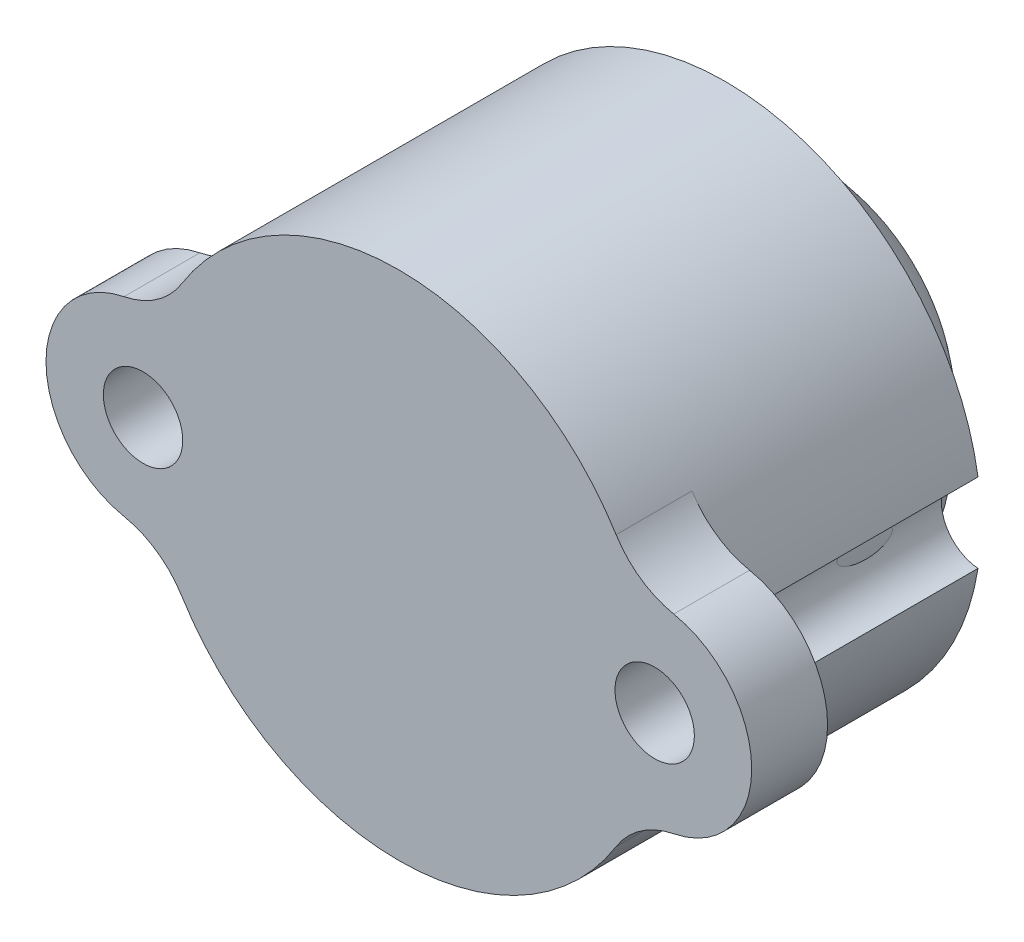
ISO-10303-21;
HEADER;
FILE_DESCRIPTION(('STEP AP214'),'2;1');
FILE_NAME('part.step','',(''),(''),'','','');
FILE_SCHEMA(('AUTOMOTIVE_DESIGN { 1 0 10303 214 1 1 1 1 }'));
ENDSEC;
DATA;
#1=APPLICATION_CONTEXT('core data for automotive mechanical design processes');
#2=APPLICATION_PROTOCOL_DEFINITION('international standard','automotive_design',2000,#1);
#3=PRODUCT_CONTEXT('',#1,'mechanical');
#4=PRODUCT('Part','Part','',(#3));
#5=PRODUCT_RELATED_PRODUCT_CATEGORY('part','',(#4));
#6=PRODUCT_DEFINITION_FORMATION('','',#4);
#7=PRODUCT_DEFINITION_CONTEXT('part definition',#1,'design');
#8=PRODUCT_DEFINITION('design','',#6,#7);
#9=PRODUCT_DEFINITION_SHAPE('','',#8);
#10=(LENGTH_UNIT() NAMED_UNIT(*) SI_UNIT(.MILLI.,.METRE.));
#11=(NAMED_UNIT(*) PLANE_ANGLE_UNIT() SI_UNIT($,.RADIAN.));
#12=(NAMED_UNIT(*) SI_UNIT($,.STERADIAN.) SOLID_ANGLE_UNIT());
#13=UNCERTAINTY_MEASURE_WITH_UNIT(LENGTH_MEASURE(1.E-05),#10,'distance_accuracy_value','');
#14=(GEOMETRIC_REPRESENTATION_CONTEXT(3) GLOBAL_UNCERTAINTY_ASSIGNED_CONTEXT((#13)) GLOBAL_UNIT_ASSIGNED_CONTEXT((#10,
#11,#12)) REPRESENTATION_CONTEXT('',''));
#15=CARTESIAN_POINT('',(0.,0.,0.));
#16=DIRECTION('',(0.,0.,1.));
#17=DIRECTION('',(1.,0.,0.));
#18=AXIS2_PLACEMENT_3D('',#15,#16,#17);
#19=CARTESIAN_POINT('',(-7.366,0.,0.));
#20=DIRECTION('',(0.,0.,1.));
#21=DIRECTION('',(1.,0.,0.));
#22=AXIS2_PLACEMENT_3D('',#19,#20,#21);
#23=CYLINDRICAL_SURFACE('',#22,1.143);
#24=CARTESIAN_POINT('',(-7.366,0.,9.398));
#25=DIRECTION('',(0.,0.,1.));
#26=DIRECTION('',(1.,0.,0.));
#27=AXIS2_PLACEMENT_3D('',#24,#25,#26);
#28=CIRCLE('',#27,1.143);
#29=CARTESIAN_POINT('',(-6.223,0.,9.398));
#30=VERTEX_POINT('',#29);
#31=EDGE_CURVE('E244',#30,#30,#28,.T.);
#32=ORIENTED_EDGE('',*,*,#31,.T.);
#33=EDGE_LOOP('',(#32));
#34=FACE_BOUND('',#33,.T.);
#35=CARTESIAN_POINT('',(-7.366,0.,0.));
#36=DIRECTION('',(0.,0.,1.));
#37=DIRECTION('',(1.,0.,0.));
#38=AXIS2_PLACEMENT_3D('',#35,#36,#37);
#39=CIRCLE('',#38,1.143);
#40=CARTESIAN_POINT('',(-7.27731896551724,-1.13955459462154,0.));
#41=VERTEX_POINT('',#40);
#42=CARTESIAN_POINT('',(-7.27731896551724,1.13955459462154,0.));
#43=VERTEX_POINT('',#42);
#44=EDGE_CURVE('E152',#41,#43,#39,.T.);
#45=ORIENTED_EDGE('',*,*,#44,.F.);
#46=DIRECTION('',(0.,0.,1.));
#47=VECTOR('',#46,1.);
#48=CARTESIAN_POINT('',(-7.27731896551724,-1.13955459462154,4.699));
#49=LINE('',#48,#47);
#50=CARTESIAN_POINT('',(-7.27731896551724,-1.13955459462154,7.2136));
#51=VERTEX_POINT('',#50);
#52=EDGE_CURVE('E66',#51,#41,#49,.F.);
#53=ORIENTED_EDGE('',*,*,#52,.F.);
#54=CARTESIAN_POINT('',(-7.366,0.,7.2136));
#55=DIRECTION('',(0.,0.,1.));
#56=DIRECTION('',(1.,0.,0.));
#57=AXIS2_PLACEMENT_3D('',#54,#55,#56);
#58=CIRCLE('',#57,1.143);
#59=CARTESIAN_POINT('',(-7.27731896551724,1.13955459462154,7.2136));
#60=VERTEX_POINT('',#59);
#61=EDGE_CURVE('E203',#60,#51,#58,.T.);
#62=ORIENTED_EDGE('',*,*,#61,.F.);
#63=DIRECTION('',(0.,0.,1.));
#64=VECTOR('',#63,1.);
#65=CARTESIAN_POINT('',(-7.27731896551724,1.13955459462154,4.699));
#66=LINE('',#65,#64);
#67=EDGE_CURVE('E249',#43,#60,#66,.T.);
#68=ORIENTED_EDGE('',*,*,#67,.F.);
#69=EDGE_LOOP('',(#45,#53,#62,#68));
#70=FACE_BOUND('',#69,.T.);
#71=CARTESIAN_POINT('',(-6.22299999667671,0.,3.00656686656911));
#72=CARTESIAN_POINT('',(-6.22300022308401,0.00854113840439753,3.00656496304866));
#73=CARTESIAN_POINT('',(-6.22309739064247,0.0170942445293236,3.00566804337497));
#74=CARTESIAN_POINT('',(-6.2234704915884,0.0338570945007122,3.00220702470581));
#75=CARTESIAN_POINT('',(-6.22374690498539,0.042065853177293,2.99963844904978));
#76=CARTESIAN_POINT('',(-6.22443571740399,0.057805020180403,2.99318784772456));
#77=CARTESIAN_POINT('',(-6.22484632200796,0.0653427943006503,2.98932313713181));
#78=CARTESIAN_POINT('',(-6.22576546470107,0.0797910081447651,2.98058911446436));
#79=CARTESIAN_POINT('',(-6.2262740150528,0.0867013691584653,2.97571967659479));
#80=CARTESIAN_POINT('',(-6.22781511439508,0.105523954284168,2.96079494743554));
#81=CARTESIAN_POINT('',(-6.22892652085305,0.116712603729425,2.94984180383498));
#82=CARTESIAN_POINT('',(-6.23124048047224,0.137395288844588,2.92644390518644));
#83=CARTESIAN_POINT('',(-6.23244336890737,0.146882616444506,2.91399355559374));
#84=CARTESIAN_POINT('',(-6.23616494735638,0.173978554588517,2.87432886175782));
#85=CARTESIAN_POINT('',(-6.23870934575976,0.189366409197521,2.84561878470594));
#86=CARTESIAN_POINT('',(-6.24357755252192,0.216326726606896,2.78649623212186));
#87=CARTESIAN_POINT('',(-6.2459007591384,0.22788898203461,2.75607945141608));
#88=CARTESIAN_POINT('',(-6.25058241423961,0.249880669760019,2.68916120019687));
#89=CARTESIAN_POINT('',(-6.25288239573668,0.259801426060839,2.65248946853826));
#90=CARTESIAN_POINT('',(-6.25696202421947,0.276687688887137,2.57842907915816));
#91=CARTESIAN_POINT('',(-6.25874104424745,0.283649639107923,2.54103961483653));
#92=CARTESIAN_POINT('',(-6.2632404180465,0.300866073946233,2.42814368806691));
#93=CARTESIAN_POINT('',(-6.26511415528667,0.307414863297735,2.35203495546075));
#94=CARTESIAN_POINT('',(-6.26658127371827,0.312630680617006,2.18817664305934));
#95=CARTESIAN_POINT('',(-6.26579367406989,0.309979291060852,2.10038074754725));
#96=CARTESIAN_POINT('',(-6.26230945073564,0.297201269522078,1.96972721365611));
#97=CARTESIAN_POINT('',(-6.26076631073974,0.291482886038891,1.92638239162202));
#98=CARTESIAN_POINT('',(-6.25695129958749,0.276627569313388,1.84033009117514));
#99=CARTESIAN_POINT('',(-6.25468026514882,0.26749455920119,1.79762193961152));
#100=CARTESIAN_POINT('',(-6.24977559412481,0.246164004699842,1.71808269188302));
#101=CARTESIAN_POINT('',(-6.24721033372765,0.234420008642109,1.6811260574621));
#102=CARTESIAN_POINT('',(-6.24167101149704,0.206277933713889,1.60891923022393));
#103=CARTESIAN_POINT('',(-6.23869737472813,0.18988467544145,1.57366731394963));
#104=CARTESIAN_POINT('',(-6.23417669898086,0.15976540784391,1.52389355260057));
#105=CARTESIAN_POINT('',(-6.23265297469159,0.148743598905754,1.50775600559318));
#106=CARTESIAN_POINT('',(-6.22970486395261,0.124240716565058,1.47748612892237));
#107=CARTESIAN_POINT('',(-6.22827986465712,0.110777135474807,1.46334073249681));
#108=CARTESIAN_POINT('',(-6.22647540782835,0.0892954815708801,1.44581907579016));
#109=CARTESIAN_POINT('',(-6.22596332372072,0.0825537685538465,1.44090348543767));
#110=CARTESIAN_POINT('',(-6.22502989662223,0.0684564006670779,1.43201312233724));
#111=CARTESIAN_POINT('',(-6.2246085634813,0.0611006792741993,1.42803845171021));
#112=CARTESIAN_POINT('',(-6.22388913821674,0.0457321645405364,1.42128848793834));
#113=CARTESIAN_POINT('',(-6.22359258840645,0.0377125356574634,1.4185281863684));
#114=CARTESIAN_POINT('',(-6.22316899766527,0.021290797262867,1.41459446047883));
#115=CARTESIAN_POINT('',(-6.22304163958676,0.0128894339810443,1.41341806708864));
#116=CARTESIAN_POINT('',(-6.22297928663091,-0.00306779867115475,1.41284166504376));
#117=CARTESIAN_POINT('',(-6.22302508019657,-0.0106174453655507,1.41326425006849));
#118=CARTESIAN_POINT('',(-6.22326056367545,-0.0255195498904053,1.41544494557921));
#119=CARTESIAN_POINT('',(-6.22345037109578,-0.0328718416156155,1.41720414666941));
#120=CARTESIAN_POINT('',(-6.22400246362474,-0.0486288568910219,1.4223504110737));
#121=CARTESIAN_POINT('',(-6.22439177081736,-0.0569476338756689,1.4259938163939));
#122=CARTESIAN_POINT('',(-6.22529820709035,-0.0728867379961656,1.43455895814869));
#123=CARTESIAN_POINT('',(-6.22581557700447,-0.0805057116429136,1.43948310403023));
#124=CARTESIAN_POINT('',(-6.22727564885445,-0.0994694743540815,1.45354433491138));
#125=CARTESIAN_POINT('',(-6.22828541229804,-0.110255302229774,1.46342010422908));
#126=CARTESIAN_POINT('',(-6.23040335672809,-0.1302692218377,1.48462021846979));
#127=CARTESIAN_POINT('',(-6.2315118138845,-0.139492718532688,1.49594866995154));
#128=CARTESIAN_POINT('',(-6.23491823116542,-0.165588511228176,1.53169584225489));
#129=CARTESIAN_POINT('',(-6.23725982403906,-0.180495882081539,1.5575267732024));
#130=CARTESIAN_POINT('',(-6.24179178384996,-0.206827642278005,1.61086691096284));
#131=CARTESIAN_POINT('',(-6.24398175166803,-0.21824309089048,1.63838021298104));
#132=CARTESIAN_POINT('',(-6.24845651038425,-0.240191733983127,1.69903969720225));
#133=CARTESIAN_POINT('',(-6.25069574045744,-0.250256865855393,1.73235745886648));
#134=CARTESIAN_POINT('',(-6.25475524534806,-0.267696298203652,1.79972582038742));
#135=CARTESIAN_POINT('',(-6.2565750095234,-0.275067325300445,1.8337772588552));
#136=CARTESIAN_POINT('',(-6.26135529026109,-0.293917574085742,1.93684587947963));
#137=CARTESIAN_POINT('',(-6.26361745612236,-0.302051686167216,2.006520319325));
#138=CARTESIAN_POINT('',(-6.26584138668923,-0.310006586863152,2.12917773206501));
#139=CARTESIAN_POINT('',(-6.26623049147241,-0.311374177048702,2.18207479532854));
#140=CARTESIAN_POINT('',(-6.26586849580632,-0.310101109987455,2.28781639470298));
#141=CARTESIAN_POINT('',(-6.26511779871686,-0.307461870701167,2.34066094277669));
#142=CARTESIAN_POINT('',(-6.26250455267668,-0.297943113933057,2.44558448135309));
#143=CARTESIAN_POINT('',(-6.26064940944644,-0.291091829869536,2.49766622468604));
#144=CARTESIAN_POINT('',(-6.25589203260003,-0.272414464957267,2.60084229938382));
#145=CARTESIAN_POINT('',(-6.25299213112302,-0.260599454598524,2.65193856501684));
#146=CARTESIAN_POINT('',(-6.2483106591492,-0.239281836319227,2.72201745087902));
#147=CARTESIAN_POINT('',(-6.24690015204811,-0.232635629522653,2.74189711886327));
#148=CARTESIAN_POINT('',(-6.24395521264304,-0.217993628415357,2.78121150800455));
#149=CARTESIAN_POINT('',(-6.2424204768858,-0.20999447400927,2.80064498109629));
#150=CARTESIAN_POINT('',(-6.23903211527194,-0.191047073699657,2.84156803185768));
#151=CARTESIAN_POINT('',(-6.23716488120863,-0.179837702331115,2.86293704381682));
#152=CARTESIAN_POINT('',(-6.23341969357164,-0.154521755566044,2.90387857447836));
#153=CARTESIAN_POINT('',(-6.23154183722226,-0.140429631758248,2.92345937561841));
#154=CARTESIAN_POINT('',(-6.22905348227471,-0.117663632088866,2.94852381302916));
#155=CARTESIAN_POINT('',(-6.22834753896103,-0.110682066384257,2.95552185367458));
#156=CARTESIAN_POINT('',(-6.22700668914755,-0.0959093922164624,2.96865010630186));
#157=CARTESIAN_POINT('',(-6.22637186275096,-0.0881173895794148,2.97477934171725));
#158=CARTESIAN_POINT('',(-6.22521067105746,-0.0715453654930485,2.98588068123091));
#159=CARTESIAN_POINT('',(-6.22468613438327,-0.0627519311664501,2.99083343024559));
#160=CARTESIAN_POINT('',(-6.22382483058762,-0.044364083627468,2.99891519101956));
#161=CARTESIAN_POINT('',(-6.22348715746092,-0.0347737991949604,3.0020530058732));
#162=CARTESIAN_POINT('',(-6.22318281039768,-0.0208555379263546,3.00487538908135));
#163=CARTESIAN_POINT('',(-6.22311458642463,-0.0167116112134069,3.00550695239828));
#164=CARTESIAN_POINT('',(-6.22302311679166,-0.0083794260998581,3.00635322511673));
#165=CARTESIAN_POINT('',(-6.22299988557819,-0.00419115389451931,3.00656780063044));
#166=CARTESIAN_POINT('',(-6.22299999667671,0.,3.00656686656911));
#167=B_SPLINE_CURVE_WITH_KNOTS('',3,(#71,#72,#73,#74,#75,#76,#77,#78,#79,#80,#81,#82,#83,#84,
#85,#86,#87,#88,#89,#90,#91,#92,#93,#94,#95,#96,#97,#98,#99,#100,#101,#102,#103,#104,#105,#106,
#107,#108,#109,#110,#111,#112,#113,#114,#115,#116,#117,#118,#119,#120,#121,#122,#123,#124,#125,
#126,#127,#128,#129,#130,#131,#132,#133,#134,#135,#136,#137,#138,#139,#140,#141,#142,#143,#144,
#145,#146,#147,#148,#149,#150,#151,#152,#153,#154,#155,#156,#157,#158,#159,#160,#161,#162,#163,
#164,#165,#166),.UNSPECIFIED.,.T.,.F.,(4,2,2,2,2,2,2,2,2,2,2,2,2,2,2,2,2,2,2,2,2,2,2,2,2,2,2,2,
2,2,2,2,2,2,2,2,2,2,2,2,2,2,2,2,2,2,2,4),(0.,0.025601135098336,0.0512711132001018,
0.0766109880506028,0.101954037456792,0.148772464767285,0.195771615266369,0.293246354630806,
0.390979114979738,0.504975144290087,0.619107805021863,0.847761736690507,1.11045360287168,
1.24159776060575,1.37259170501744,1.48902327644293,1.60533456413472,1.66400551153925,
1.72227165998144,1.74729093625798,1.77231292671006,1.79763569686021,1.82291093252669,
1.84546842239889,1.86804433771815,1.89516329093806,1.92233363656938,1.96606172450585,
2.00991627016652,2.09916407251109,2.18863850862883,2.29310010976195,2.39768821472706,
2.60766935752575,2.76628815621027,2.92485083501937,3.08236208152276,3.23952388356425,
3.30251534493054,3.36566560895875,3.43814840082655,3.5102763608157,3.53995448396791,
3.56966570620202,3.59983628323838,3.62985926752443,3.64241776465314,3.65498029343927),.UNSPECIFIED.);
#168=CARTESIAN_POINT('',(-6.22299999667671,0.,3.00656686656911));
#169=VERTEX_POINT('',#168);
#170=EDGE_CURVE('E50',#169,#169,#167,.T.);
#171=ORIENTED_EDGE('',*,*,#170,.F.);
#172=EDGE_LOOP('',(#171));
#173=FACE_BOUND('',#172,.T.);
#174=ADVANCED_FACE('F36',(#34,#70,#173),#23,.F.);
#175=CARTESIAN_POINT('',(7.366,0.,0.));
#176=DIRECTION('',(0.,0.,1.));
#177=DIRECTION('',(1.,0.,0.));
#178=AXIS2_PLACEMENT_3D('',#175,#176,#177);
#179=CYLINDRICAL_SURFACE('',#178,1.143);
#180=CARTESIAN_POINT('',(7.366,0.,9.398));
#181=DIRECTION('',(0.,0.,1.));
#182=DIRECTION('',(1.,0.,0.));
#183=AXIS2_PLACEMENT_3D('',#180,#181,#182);
#184=CIRCLE('',#183,1.143);
#185=CARTESIAN_POINT('',(8.509,0.,9.398));
#186=VERTEX_POINT('',#185);
#187=EDGE_CURVE('E139',#186,#186,#184,.T.);
#188=ORIENTED_EDGE('',*,*,#187,.T.);
#189=EDGE_LOOP('',(#188));
#190=FACE_BOUND('',#189,.T.);
#191=CARTESIAN_POINT('',(7.366,0.,0.));
#192=DIRECTION('',(0.,0.,1.));
#193=DIRECTION('',(1.,0.,0.));
#194=AXIS2_PLACEMENT_3D('',#191,#192,#193);
#195=CIRCLE('',#194,1.143);
#196=CARTESIAN_POINT('',(7.27731896551724,1.13955459462154,0.));
#197=VERTEX_POINT('',#196);
#198=CARTESIAN_POINT('',(7.27731896551724,-1.13955459462154,0.));
#199=VERTEX_POINT('',#198);
#200=EDGE_CURVE('E130',#197,#199,#195,.T.);
#201=ORIENTED_EDGE('',*,*,#200,.F.);
#202=DIRECTION('',(0.,0.,1.));
#203=VECTOR('',#202,1.);
#204=CARTESIAN_POINT('',(7.27731896551724,1.13955459462154,4.699));
#205=LINE('',#204,#203);
#206=CARTESIAN_POINT('',(7.27731896551724,1.13955459462154,7.2136));
#207=VERTEX_POINT('',#206);
#208=EDGE_CURVE('E58',#207,#197,#205,.F.);
#209=ORIENTED_EDGE('',*,*,#208,.F.);
#210=CARTESIAN_POINT('',(7.366,0.,7.2136));
#211=DIRECTION('',(0.,0.,1.));
#212=DIRECTION('',(1.,0.,0.));
#213=AXIS2_PLACEMENT_3D('',#210,#211,#212);
#214=CIRCLE('',#213,1.143);
#215=CARTESIAN_POINT('',(7.27731896551724,-1.13955459462153,7.2136));
#216=VERTEX_POINT('',#215);
#217=EDGE_CURVE('E204',#216,#207,#214,.T.);
#218=ORIENTED_EDGE('',*,*,#217,.F.);
#219=DIRECTION('',(0.,0.,1.));
#220=VECTOR('',#219,1.);
#221=CARTESIAN_POINT('',(7.27731896551724,-1.13955459462154,4.699));
#222=LINE('',#221,#220);
#223=EDGE_CURVE('E134',#199,#216,#222,.T.);
#224=ORIENTED_EDGE('',*,*,#223,.F.);
#225=EDGE_LOOP('',(#201,#209,#218,#224));
#226=FACE_BOUND('',#225,.T.);
#227=CARTESIAN_POINT('',(6.22299999667671,0.,3.0065668665691));
#228=CARTESIAN_POINT('',(6.22300022308401,-0.00854113840439642,3.00656496304865));
#229=CARTESIAN_POINT('',(6.22309739064247,-0.0170942445293212,3.00566804337496));
#230=CARTESIAN_POINT('',(6.2234704915884,-0.0338570945007106,3.0022070247058));
#231=CARTESIAN_POINT('',(6.22374690498539,-0.0420658531772933,2.99963844904978));
#232=CARTESIAN_POINT('',(6.22443571740399,-0.0578050201804024,2.99318784772456));
#233=CARTESIAN_POINT('',(6.22484632200796,-0.0653427943006468,2.9893231371318));
#234=CARTESIAN_POINT('',(6.22576546470108,-0.0797910081447599,2.98058911446435));
#235=CARTESIAN_POINT('',(6.2262740150528,-0.0867013691584614,2.97571967659478));
#236=CARTESIAN_POINT('',(6.22781511439508,-0.105523954284167,2.96079494743553));
#237=CARTESIAN_POINT('',(6.22892652085306,-0.116712603729425,2.94984180383497));
#238=CARTESIAN_POINT('',(6.23124048047224,-0.137395288844587,2.92644390518643));
#239=CARTESIAN_POINT('',(6.23244336890737,-0.146882616444503,2.91399355559373));
#240=CARTESIAN_POINT('',(6.23616494735638,-0.17397855458851,2.87432886175781));
#241=CARTESIAN_POINT('',(6.23870934575976,-0.189366409197517,2.84561878470593));
#242=CARTESIAN_POINT('',(6.24357755252192,-0.216326726606894,2.78649623212185));
#243=CARTESIAN_POINT('',(6.2459007591384,-0.227888982034608,2.75607945141607));
#244=CARTESIAN_POINT('',(6.25058241423961,-0.249880669760017,2.68916120019686));
#245=CARTESIAN_POINT('',(6.25288239573669,-0.259801426060836,2.65248946853825));
#246=CARTESIAN_POINT('',(6.25696202421947,-0.276687688887134,2.57842907915816));
#247=CARTESIAN_POINT('',(6.25874104424745,-0.28364963910792,2.54103961483653));
#248=CARTESIAN_POINT('',(6.2632404180465,-0.30086607394623,2.4281436880669));
#249=CARTESIAN_POINT('',(6.26511415528667,-0.307414863297729,2.35203495546074));
#250=CARTESIAN_POINT('',(6.26658127371827,-0.312630680616998,2.18817664305933));
#251=CARTESIAN_POINT('',(6.26579367406989,-0.309979291060844,2.10038074754725));
#252=CARTESIAN_POINT('',(6.26230945073564,-0.297201269522069,1.96972721365611));
#253=CARTESIAN_POINT('',(6.26076631073974,-0.291482886038882,1.92638239162201));
#254=CARTESIAN_POINT('',(6.25695129958749,-0.276627569313378,1.84033009117513));
#255=CARTESIAN_POINT('',(6.25468026514882,-0.26749455920118,1.79762193961151));
#256=CARTESIAN_POINT('',(6.24977559412481,-0.246164004699832,1.71808269188301));
#257=CARTESIAN_POINT('',(6.24721033372764,-0.234420008642099,1.6811260574621));
#258=CARTESIAN_POINT('',(6.24167101149704,-0.206277933713883,1.60891923022393));
#259=CARTESIAN_POINT('',(6.23869737472813,-0.189884675441447,1.57366731394963));
#260=CARTESIAN_POINT('',(6.23417669898086,-0.159765407843902,1.52389355260057));
#261=CARTESIAN_POINT('',(6.23265297469159,-0.148743598905742,1.50775600559318));
#262=CARTESIAN_POINT('',(6.22970486395261,-0.124240716565043,1.47748612892238));
#263=CARTESIAN_POINT('',(6.22827986465712,-0.110777135474793,1.46334073249681));
#264=CARTESIAN_POINT('',(6.22647540782835,-0.0892954815708678,1.44581907579017));
#265=CARTESIAN_POINT('',(6.22596332372072,-0.0825537685538348,1.44090348543767));
#266=CARTESIAN_POINT('',(6.22502989662223,-0.0684564006670645,1.43201312233724));
#267=CARTESIAN_POINT('',(6.2246085634813,-0.0611006792741837,1.42803845171022));
#268=CARTESIAN_POINT('',(6.22388913821674,-0.045732164540519,1.42128848793835));
#269=CARTESIAN_POINT('',(6.22359258840645,-0.0377125356574464,1.4185281863684));
#270=CARTESIAN_POINT('',(6.22316899766527,-0.02129079726285,1.41459446047884));
#271=CARTESIAN_POINT('',(6.22304163958676,-0.0128894339810269,1.41341806708865));
#272=CARTESIAN_POINT('',(6.22297928663091,0.00306779867117179,1.41284166504377));
#273=CARTESIAN_POINT('',(6.22302508019657,0.010617445365567,1.4132642500685));
#274=CARTESIAN_POINT('',(6.22326056367545,0.0255195498904203,1.41544494557922));
#275=CARTESIAN_POINT('',(6.22345037109578,0.03287184161563,1.41720414666942));
#276=CARTESIAN_POINT('',(6.22400246362475,0.0486288568910363,1.42235041107371));
#277=CARTESIAN_POINT('',(6.22439177081736,0.0569476338756838,1.42599381639391));
#278=CARTESIAN_POINT('',(6.22529820709035,0.0728867379961817,1.43455895814871));
#279=CARTESIAN_POINT('',(6.22581557700447,0.0805057116429304,1.43948310403024));
#280=CARTESIAN_POINT('',(6.22727564885445,0.0994694743540984,1.45354433491139));
#281=CARTESIAN_POINT('',(6.22828541229804,0.110255302229789,1.4634201042291));
#282=CARTESIAN_POINT('',(6.2304033567281,0.130269221837716,1.48462021846982));
#283=CARTESIAN_POINT('',(6.2315118138845,0.139492718532706,1.49594866995157));
#284=CARTESIAN_POINT('',(6.23491823116542,0.1655885112282,1.53169584225492));
#285=CARTESIAN_POINT('',(6.23725982403906,0.18049588208156,1.55752677320245));
#286=CARTESIAN_POINT('',(6.24179178384997,0.206827642278027,1.6108669109629));
#287=CARTESIAN_POINT('',(6.24398175166804,0.218243090890504,1.63838021298111));
#288=CARTESIAN_POINT('',(6.24845651038426,0.240191733983153,1.69903969720233));
#289=CARTESIAN_POINT('',(6.25069574045745,0.250256865855417,1.73235745886657));
#290=CARTESIAN_POINT('',(6.25475524534806,0.267696298203676,1.79972582038753));
#291=CARTESIAN_POINT('',(6.25657500952341,0.275067325300469,1.83377725885532));
#292=CARTESIAN_POINT('',(6.26135529026109,0.293917574085764,1.93684587947978));
#293=CARTESIAN_POINT('',(6.26361745612237,0.302051686167234,2.00652031932516));
#294=CARTESIAN_POINT('',(6.26584138668923,0.310006586863157,2.12917773206518));
#295=CARTESIAN_POINT('',(6.26623049147241,0.311374177048701,2.1820747953287));
#296=CARTESIAN_POINT('',(6.26586849580632,0.310101109987445,2.28781639470312));
#297=CARTESIAN_POINT('',(6.26511779871686,0.307461870701155,2.34066094277683));
#298=CARTESIAN_POINT('',(6.26250455267668,0.297943113933042,2.44558448135321));
#299=CARTESIAN_POINT('',(6.26064940944643,0.291091829869519,2.49766622468615));
#300=CARTESIAN_POINT('',(6.25589203260002,0.272414464957243,2.60084229938391));
#301=CARTESIAN_POINT('',(6.25299213112302,0.260599454598496,2.65193856501693));
#302=CARTESIAN_POINT('',(6.24831065914919,0.2392818363192,2.7220174508791));
#303=CARTESIAN_POINT('',(6.24690015204811,0.232635629522627,2.74189711886334));
#304=CARTESIAN_POINT('',(6.24395521264303,0.217993628415331,2.78121150800461));
#305=CARTESIAN_POINT('',(6.2424204768858,0.209994474009243,2.80064498109635));
#306=CARTESIAN_POINT('',(6.23903211527194,0.191047073699632,2.84156803185773));
#307=CARTESIAN_POINT('',(6.23716488120863,0.179837702331093,2.86293704381686));
#308=CARTESIAN_POINT('',(6.23341969357164,0.15452175556602,2.90387857447839));
#309=CARTESIAN_POINT('',(6.23154183722226,0.140429631758218,2.92345937561843));
#310=CARTESIAN_POINT('',(6.22905348227471,0.117663632088842,2.94852381302919));
#311=CARTESIAN_POINT('',(6.22834753896103,0.110682066384236,2.9555218536746));
#312=CARTESIAN_POINT('',(6.22700668914755,0.0959093922164409,2.96865010630188));
#313=CARTESIAN_POINT('',(6.22637186275096,0.0881173895793905,2.97477934171726));
#314=CARTESIAN_POINT('',(6.22521067105746,0.0715453654930226,2.98588068123092));
#315=CARTESIAN_POINT('',(6.22468613438327,0.0627519311664253,2.9908334302456));
#316=CARTESIAN_POINT('',(6.22382483058762,0.0443640836274427,2.99891519101956));
#317=CARTESIAN_POINT('',(6.22348715746092,0.0347737991949334,3.00205300587319));
#318=CARTESIAN_POINT('',(6.22318281039768,0.0208555379263323,3.00487538908134));
#319=CARTESIAN_POINT('',(6.22311458642463,0.0167116112133893,3.00550695239827));
#320=CARTESIAN_POINT('',(6.22302311679166,0.0083794260998496,3.00635322511672));
#321=CARTESIAN_POINT('',(6.22299988557819,0.00419115389451528,3.00656780063044));
#322=CARTESIAN_POINT('',(6.22299999667671,0.,3.0065668665691));
#323=B_SPLINE_CURVE_WITH_KNOTS('',3,(#227,#228,#229,#230,#231,#232,#233,#234,#235,#236,#237,
#238,#239,#240,#241,#242,#243,#244,#245,#246,#247,#248,#249,#250,#251,#252,#253,#254,#255,#256,
#257,#258,#259,#260,#261,#262,#263,#264,#265,#266,#267,#268,#269,#270,#271,#272,#273,#274,#275,
#276,#277,#278,#279,#280,#281,#282,#283,#284,#285,#286,#287,#288,#289,#290,#291,#292,#293,#294,
#295,#296,#297,#298,#299,#300,#301,#302,#303,#304,#305,#306,#307,#308,#309,#310,#311,#312,#313,
#314,#315,#316,#317,#318,#319,#320,#321,#322),.UNSPECIFIED.,.T.,.F.,(4,2,2,2,2,2,2,2,2,2,2,2,2,
2,2,2,2,2,2,2,2,2,2,2,2,2,2,2,2,2,2,2,2,2,2,2,2,2,2,2,2,2,2,2,2,2,2,4),(0.,0.025601135098335,
0.0512711132001005,0.076610988050602,0.101954037456791,0.148772464767285,0.195771615266369,
0.293246354630803,0.390979114979734,0.504975144290083,0.61910780502186,0.847761736690505,
1.11045360287168,1.24159776060575,1.37259170501744,1.48902327644292,1.60533456413471,
1.66400551153924,1.72227165998144,1.74729093625798,1.77231292671005,1.7976356968602,
1.82291093252668,1.84546842239888,1.86804433771814,1.89516329093805,1.92233363656937,
1.96606172450585,2.00991627016653,2.09916407251112,2.18863850862888,2.29310010976203,
2.39768821472716,2.6076693575259,2.76628815621039,2.92485083501947,3.08236208152284,
3.2395238835643,3.30251534493058,3.36566560895878,3.43814840082656,3.5102763608157,
3.5399544839679,3.56966570620202,3.59983628323837,3.62985926752441,3.64241776465312,
3.65498029343923),.UNSPECIFIED.);
#324=CARTESIAN_POINT('',(6.22299999667671,0.,3.0065668665691));
#325=VERTEX_POINT('',#324);
#326=EDGE_CURVE('E40',#325,#325,#323,.T.);
#327=ORIENTED_EDGE('',*,*,#326,.F.);
#328=EDGE_LOOP('',(#327));
#329=FACE_BOUND('',#328,.T.);
#330=ADVANCED_FACE('F131',(#190,#226,#329),#179,.F.);
#331=CARTESIAN_POINT('',(0.,0.,9.398));
#332=DIRECTION('',(0.,0.,-1.));
#333=DIRECTION('',(-1.,0.,0.));
#334=AXIS2_PLACEMENT_3D('',#331,#332,#333);
#335=CYLINDRICAL_SURFACE('',#334,7.366);
#336=CARTESIAN_POINT('',(0.,0.,0.));
#337=DIRECTION('',(0.,0.,1.));
#338=DIRECTION('',(1.,0.,0.));
#339=AXIS2_PLACEMENT_3D('',#336,#337,#338);
#340=CIRCLE('',#339,7.366);
#341=EDGE_CURVE('E153',#41,#199,#340,.T.);
#342=ORIENTED_EDGE('',*,*,#341,.T.);
#343=ORIENTED_EDGE('',*,*,#223,.T.);
#344=CARTESIAN_POINT('',(0.,0.,7.2136));
#345=DIRECTION('',(0.,0.,1.));
#346=DIRECTION('',(1.,0.,0.));
#347=AXIS2_PLACEMENT_3D('',#344,#345,#346);
#348=CIRCLE('',#347,7.366);
#349=CARTESIAN_POINT('',(6.2555641025641,-3.88919962957822,7.2136));
#350=VERTEX_POINT('',#349);
#351=EDGE_CURVE('E158',#350,#216,#348,.T.);
#352=ORIENTED_EDGE('',*,*,#351,.F.);
#353=DIRECTION('',(0.,0.,-1.));
#354=VECTOR('',#353,1.);
#355=CARTESIAN_POINT('',(6.25556410256411,-3.88919962957822,9.398));
#356=LINE('',#355,#354);
#357=CARTESIAN_POINT('',(6.2555641025641,-3.88919962957822,9.398));
#358=VERTEX_POINT('',#357);
#359=EDGE_CURVE('E175',#350,#358,#356,.F.);
#360=ORIENTED_EDGE('',*,*,#359,.T.);
#361=CARTESIAN_POINT('',(0.,0.,9.398));
#362=DIRECTION('',(0.,0.,1.));
#363=DIRECTION('',(1.,0.,0.));
#364=AXIS2_PLACEMENT_3D('',#361,#362,#363);
#365=CIRCLE('',#364,7.366);
#366=CARTESIAN_POINT('',(-6.2555641025641,-3.88919962957822,9.398));
#367=VERTEX_POINT('',#366);
#368=EDGE_CURVE('E156',#367,#358,#365,.T.);
#369=ORIENTED_EDGE('',*,*,#368,.F.);
#370=DIRECTION('',(0.,0.,-1.));
#371=VECTOR('',#370,1.);
#372=CARTESIAN_POINT('',(-6.2555641025641,-3.88919962957822,9.398));
#373=LINE('',#372,#371);
#374=CARTESIAN_POINT('',(-6.2555641025641,-3.88919962957822,7.2136));
#375=VERTEX_POINT('',#374);
#376=EDGE_CURVE('E172',#367,#375,#373,.T.);
#377=ORIENTED_EDGE('',*,*,#376,.T.);
#378=CARTESIAN_POINT('',(0.,0.,7.2136));
#379=DIRECTION('',(0.,0.,1.));
#380=DIRECTION('',(1.,0.,0.));
#381=AXIS2_PLACEMENT_3D('',#378,#379,#380);
#382=CIRCLE('',#381,7.366);
#383=EDGE_CURVE('E256',#51,#375,#382,.T.);
#384=ORIENTED_EDGE('',*,*,#383,.F.);
#385=ORIENTED_EDGE('',*,*,#52,.T.);
#386=EDGE_LOOP('',(#342,#343,#352,#360,#369,#377,#384,#385));
#387=FACE_BOUND('',#386,.T.);
#388=ADVANCED_FACE('F230',(#387),#335,.T.);
#389=CARTESIAN_POINT('',(6.2555641025641,3.88919962957822,7.2136));
#390=VERTEX_POINT('',#389);
#391=EDGE_CURVE('E148',#207,#390,#348,.T.);
#392=ORIENTED_EDGE('',*,*,#391,.F.);
#393=ORIENTED_EDGE('',*,*,#208,.T.);
#394=EDGE_CURVE('E145',#197,#43,#340,.T.);
#395=ORIENTED_EDGE('',*,*,#394,.T.);
#396=ORIENTED_EDGE('',*,*,#67,.T.);
#397=CARTESIAN_POINT('',(-6.2555641025641,3.88919962957822,7.2136));
#398=VERTEX_POINT('',#397);
#399=EDGE_CURVE('E252',#398,#60,#382,.T.);
#400=ORIENTED_EDGE('',*,*,#399,.F.);
#401=DIRECTION('',(0.,0.,-1.));
#402=VECTOR('',#401,1.);
#403=CARTESIAN_POINT('',(-6.2555641025641,3.88919962957822,9.398));
#404=LINE('',#403,#402);
#405=CARTESIAN_POINT('',(-6.2555641025641,3.88919962957822,9.398));
#406=VERTEX_POINT('',#405);
#407=EDGE_CURVE('E169',#398,#406,#404,.F.);
#408=ORIENTED_EDGE('',*,*,#407,.T.);
#409=CARTESIAN_POINT('',(6.2555641025641,3.88919962957822,9.398));
#410=VERTEX_POINT('',#409);
#411=EDGE_CURVE('E162',#410,#406,#365,.T.);
#412=ORIENTED_EDGE('',*,*,#411,.F.);
#413=DIRECTION('',(0.,0.,-1.));
#414=VECTOR('',#413,1.);
#415=CARTESIAN_POINT('',(6.2555641025641,3.88919962957822,9.398));
#416=LINE('',#415,#414);
#417=EDGE_CURVE('E178',#410,#390,#416,.T.);
#418=ORIENTED_EDGE('',*,*,#417,.T.);
#419=EDGE_LOOP('',(#392,#393,#395,#396,#400,#408,#412,#418));
#420=FACE_BOUND('',#419,.T.);
#421=ADVANCED_FACE('F143',(#420),#335,.T.);
#422=CARTESIAN_POINT('',(0.,0.,9.398));
#423=DIRECTION('',(0.,0.,1.));
#424=DIRECTION('',(1.,0.,0.));
#425=AXIS2_PLACEMENT_3D('',#422,#423,#424);
#426=PLANE('',#425);
#427=ORIENTED_EDGE('',*,*,#187,.F.);
#428=EDGE_LOOP('',(#427));
#429=FACE_BOUND('',#428,.T.);
#430=ORIENTED_EDGE('',*,*,#31,.F.);
#431=EDGE_LOOP('',(#430));
#432=FACE_BOUND('',#431,.T.);
#433=CARTESIAN_POINT('',(7.366,0.,9.398));
#434=DIRECTION('',(0.,0.,1.));
#435=DIRECTION('',(1.,0.,0.));
#436=AXIS2_PLACEMENT_3D('',#433,#434,#435);
#437=CIRCLE('',#436,2.794);
#438=CARTESIAN_POINT('',(7.91424794745484,-2.73968249768318,9.398));
#439=VERTEX_POINT('',#438);
#440=CARTESIAN_POINT('',(7.91424794745484,2.73968249768318,9.398));
#441=VERTEX_POINT('',#440);
#442=EDGE_CURVE('E259',#439,#441,#437,.T.);
#443=ORIENTED_EDGE('',*,*,#442,.T.);
#444=CARTESIAN_POINT('',(8.41265517241379,5.23030295012244,9.398));
#445=DIRECTION('',(0.,0.,1.));
#446=DIRECTION('',(1.,0.,0.));
#447=AXIS2_PLACEMENT_3D('',#444,#445,#446);
#448=CIRCLE('',#447,2.54);
#449=EDGE_CURVE('E185',#441,#410,#448,.F.);
#450=ORIENTED_EDGE('',*,*,#449,.T.);
#451=ORIENTED_EDGE('',*,*,#411,.T.);
#452=CARTESIAN_POINT('',(-8.41265517241379,5.23030295012243,9.398));
#453=DIRECTION('',(0.,0.,1.));
#454=DIRECTION('',(1.,0.,0.));
#455=AXIS2_PLACEMENT_3D('',#452,#453,#454);
#456=CIRCLE('',#455,2.54);
#457=CARTESIAN_POINT('',(-7.91424794745484,2.73968249768318,9.398));
#458=VERTEX_POINT('',#457);
#459=EDGE_CURVE('E198',#406,#458,#456,.F.);
#460=ORIENTED_EDGE('',*,*,#459,.T.);
#461=CARTESIAN_POINT('',(-7.366,0.,9.398));
#462=DIRECTION('',(0.,0.,1.));
#463=DIRECTION('',(1.,0.,0.));
#464=AXIS2_PLACEMENT_3D('',#461,#462,#463);
#465=CIRCLE('',#464,2.794);
#466=CARTESIAN_POINT('',(-7.91424794745484,-2.73968249768318,9.398));
#467=VERTEX_POINT('',#466);
#468=EDGE_CURVE('E251',#458,#467,#465,.T.);
#469=ORIENTED_EDGE('',*,*,#468,.T.);
#470=CARTESIAN_POINT('',(-8.41265517241379,-5.23030295012243,9.398));
#471=DIRECTION('',(0.,0.,1.));
#472=DIRECTION('',(1.,0.,0.));
#473=AXIS2_PLACEMENT_3D('',#470,#471,#472);
#474=CIRCLE('',#473,2.54);
#475=EDGE_CURVE('E194',#467,#367,#474,.F.);
#476=ORIENTED_EDGE('',*,*,#475,.T.);
#477=ORIENTED_EDGE('',*,*,#368,.T.);
#478=CARTESIAN_POINT('',(8.41265517241379,-5.23030295012243,9.398));
#479=DIRECTION('',(0.,0.,1.));
#480=DIRECTION('',(1.,0.,0.));
#481=AXIS2_PLACEMENT_3D('',#478,#479,#480);
#482=CIRCLE('',#481,2.54);
#483=EDGE_CURVE('E189',#358,#439,#482,.F.);
#484=ORIENTED_EDGE('',*,*,#483,.T.);
#485=EDGE_LOOP('',(#443,#450,#451,#460,#469,#476,#477,#484));
#486=FACE_BOUND('',#485,.T.);
#487=ADVANCED_FACE('F284',(#429,#432,#486),#426,.T.);
#488=CARTESIAN_POINT('',(0.,0.,0.));
#489=DIRECTION('',(0.,0.,1.));
#490=DIRECTION('',(1.,0.,0.));
#491=AXIS2_PLACEMENT_3D('',#488,#489,#490);
#492=PLANE('',#491);
#493=CARTESIAN_POINT('',(0.,0.,0.));
#494=DIRECTION('',(0.,0.,1.));
#495=DIRECTION('',(1.,0.,0.));
#496=AXIS2_PLACEMENT_3D('',#493,#494,#495);
#497=CIRCLE('',#496,5.87174168369148);
#498=CARTESIAN_POINT('',(5.87174168369148,0.,0.));
#499=VERTEX_POINT('',#498);
#500=EDGE_CURVE('E11',#499,#499,#497,.F.);
#501=ORIENTED_EDGE('',*,*,#500,.F.);
#502=EDGE_LOOP('',(#501));
#503=FACE_BOUND('',#502,.T.);
#504=ORIENTED_EDGE('',*,*,#394,.F.);
#505=ORIENTED_EDGE('',*,*,#200,.T.);
#506=ORIENTED_EDGE('',*,*,#341,.F.);
#507=ORIENTED_EDGE('',*,*,#44,.T.);
#508=EDGE_LOOP('',(#504,#505,#506,#507));
#509=FACE_BOUND('',#508,.T.);
#510=ADVANCED_FACE('F151',(#503,#509),#492,.F.);
#511=CARTESIAN_POINT('',(7.366,0.,7.2136));
#512=DIRECTION('',(0.,0.,1.));
#513=DIRECTION('',(1.,0.,0.));
#514=AXIS2_PLACEMENT_3D('',#511,#512,#513);
#515=CYLINDRICAL_SURFACE('',#514,2.794);
#516=CARTESIAN_POINT('',(7.366,0.,7.2136));
#517=DIRECTION('',(0.,0.,1.));
#518=DIRECTION('',(1.,0.,0.));
#519=AXIS2_PLACEMENT_3D('',#516,#517,#518);
#520=CIRCLE('',#519,2.794);
#521=CARTESIAN_POINT('',(7.91424794745484,-2.73968249768318,7.2136));
#522=VERTEX_POINT('',#521);
#523=CARTESIAN_POINT('',(7.91424794745484,2.73968249768318,7.2136));
#524=VERTEX_POINT('',#523);
#525=EDGE_CURVE('E154',#522,#524,#520,.T.);
#526=ORIENTED_EDGE('',*,*,#525,.T.);
#527=DIRECTION('',(0.,0.,1.));
#528=VECTOR('',#527,1.);
#529=CARTESIAN_POINT('',(7.91424794745484,2.73968249768318,7.2136));
#530=LINE('',#529,#528);
#531=EDGE_CURVE('E166',#524,#441,#530,.T.);
#532=ORIENTED_EDGE('',*,*,#531,.T.);
#533=ORIENTED_EDGE('',*,*,#442,.F.);
#534=DIRECTION('',(0.,0.,1.));
#535=VECTOR('',#534,1.);
#536=CARTESIAN_POINT('',(7.91424794745484,-2.73968249768318,7.2136));
#537=LINE('',#536,#535);
#538=EDGE_CURVE('E164',#439,#522,#537,.F.);
#539=ORIENTED_EDGE('',*,*,#538,.T.);
#540=EDGE_LOOP('',(#526,#532,#533,#539));
#541=FACE_BOUND('',#540,.T.);
#542=ADVANCED_FACE('F275',(#541),#515,.T.);
#543=CARTESIAN_POINT('',(0.,0.,7.2136));
#544=DIRECTION('',(0.,0.,1.));
#545=DIRECTION('',(1.,0.,0.));
#546=AXIS2_PLACEMENT_3D('',#543,#544,#545);
#547=PLANE('',#546);
#548=ORIENTED_EDGE('',*,*,#351,.T.);
#549=ORIENTED_EDGE('',*,*,#217,.T.);
#550=ORIENTED_EDGE('',*,*,#391,.T.);
#551=CARTESIAN_POINT('',(8.41265517241379,5.23030295012244,7.2136));
#552=DIRECTION('',(0.,0.,1.));
#553=DIRECTION('',(1.,0.,0.));
#554=AXIS2_PLACEMENT_3D('',#551,#552,#553);
#555=CIRCLE('',#554,2.54);
#556=EDGE_CURVE('E187',#390,#524,#555,.T.);
#557=ORIENTED_EDGE('',*,*,#556,.T.);
#558=ORIENTED_EDGE('',*,*,#525,.F.);
#559=CARTESIAN_POINT('',(8.41265517241379,-5.23030295012243,7.2136));
#560=DIRECTION('',(0.,0.,1.));
#561=DIRECTION('',(1.,0.,0.));
#562=AXIS2_PLACEMENT_3D('',#559,#560,#561);
#563=CIRCLE('',#562,2.54);
#564=EDGE_CURVE('E191',#522,#350,#563,.T.);
#565=ORIENTED_EDGE('',*,*,#564,.T.);
#566=EDGE_LOOP('',(#548,#549,#550,#557,#558,#565));
#567=FACE_BOUND('',#566,.T.);
#568=ADVANCED_FACE('F265',(#567),#547,.F.);
#569=CARTESIAN_POINT('',(-7.366,0.,7.2136));
#570=DIRECTION('',(0.,0.,1.));
#571=DIRECTION('',(1.,0.,0.));
#572=AXIS2_PLACEMENT_3D('',#569,#570,#571);
#573=CYLINDRICAL_SURFACE('',#572,2.794);
#574=CARTESIAN_POINT('',(-7.366,0.,7.2136));
#575=DIRECTION('',(0.,0.,1.));
#576=DIRECTION('',(1.,0.,0.));
#577=AXIS2_PLACEMENT_3D('',#574,#575,#576);
#578=CIRCLE('',#577,2.794);
#579=CARTESIAN_POINT('',(-7.91424794745484,2.73968249768318,7.2136));
#580=VERTEX_POINT('',#579);
#581=CARTESIAN_POINT('',(-7.91424794745484,-2.73968249768318,7.2136));
#582=VERTEX_POINT('',#581);
#583=EDGE_CURVE('E255',#580,#582,#578,.T.);
#584=ORIENTED_EDGE('',*,*,#583,.T.);
#585=DIRECTION('',(0.,0.,1.));
#586=VECTOR('',#585,1.);
#587=CARTESIAN_POINT('',(-7.91424794745484,-2.73968249768318,7.2136));
#588=LINE('',#587,#586);
#589=EDGE_CURVE('E182',#582,#467,#588,.T.);
#590=ORIENTED_EDGE('',*,*,#589,.T.);
#591=ORIENTED_EDGE('',*,*,#468,.F.);
#592=DIRECTION('',(0.,0.,1.));
#593=VECTOR('',#592,1.);
#594=CARTESIAN_POINT('',(-7.91424794745484,2.73968249768318,7.2136));
#595=LINE('',#594,#593);
#596=EDGE_CURVE('E180',#458,#580,#595,.F.);
#597=ORIENTED_EDGE('',*,*,#596,.T.);
#598=EDGE_LOOP('',(#584,#590,#591,#597));
#599=FACE_BOUND('',#598,.T.);
#600=ADVANCED_FACE('F290',(#599),#573,.T.);
#601=CARTESIAN_POINT('',(0.,0.,7.2136));
#602=DIRECTION('',(0.,0.,1.));
#603=DIRECTION('',(1.,0.,0.));
#604=AXIS2_PLACEMENT_3D('',#601,#602,#603);
#605=PLANE('',#604);
#606=ORIENTED_EDGE('',*,*,#399,.T.);
#607=ORIENTED_EDGE('',*,*,#61,.T.);
#608=ORIENTED_EDGE('',*,*,#383,.T.);
#609=CARTESIAN_POINT('',(-8.41265517241379,-5.23030295012243,7.2136));
#610=DIRECTION('',(0.,0.,1.));
#611=DIRECTION('',(1.,0.,0.));
#612=AXIS2_PLACEMENT_3D('',#609,#610,#611);
#613=CIRCLE('',#612,2.54);
#614=EDGE_CURVE('E196',#375,#582,#613,.T.);
#615=ORIENTED_EDGE('',*,*,#614,.T.);
#616=ORIENTED_EDGE('',*,*,#583,.F.);
#617=CARTESIAN_POINT('',(-8.41265517241379,5.23030295012243,7.2136));
#618=DIRECTION('',(0.,0.,1.));
#619=DIRECTION('',(1.,0.,0.));
#620=AXIS2_PLACEMENT_3D('',#617,#618,#619);
#621=CIRCLE('',#620,2.54);
#622=EDGE_CURVE('E200',#580,#398,#621,.T.);
#623=ORIENTED_EDGE('',*,*,#622,.T.);
#624=EDGE_LOOP('',(#606,#607,#608,#615,#616,#623));
#625=FACE_BOUND('',#624,.T.);
#626=ADVANCED_FACE('F295',(#625),#605,.F.);
#627=CARTESIAN_POINT('',(8.41265517241379,5.23030295012244,9.398));
#628=DIRECTION('',(0.,0.,-1.));
#629=DIRECTION('',(-1.,0.,0.));
#630=AXIS2_PLACEMENT_3D('',#627,#628,#629);
#631=CYLINDRICAL_SURFACE('',#630,2.54);
#632=ORIENTED_EDGE('',*,*,#556,.F.);
#633=ORIENTED_EDGE('',*,*,#417,.F.);
#634=ORIENTED_EDGE('',*,*,#449,.F.);
#635=ORIENTED_EDGE('',*,*,#531,.F.);
#636=EDGE_LOOP('',(#632,#633,#634,#635));
#637=FACE_BOUND('',#636,.T.);
#638=ADVANCED_FACE('F273',(#637),#631,.F.);
#639=CARTESIAN_POINT('',(8.41265517241379,-5.23030295012243,7.2136));
#640=DIRECTION('',(0.,0.,-1.));
#641=DIRECTION('',(-1.,0.,0.));
#642=AXIS2_PLACEMENT_3D('',#639,#640,#641);
#643=CYLINDRICAL_SURFACE('',#642,2.54);
#644=ORIENTED_EDGE('',*,*,#564,.F.);
#645=ORIENTED_EDGE('',*,*,#538,.F.);
#646=ORIENTED_EDGE('',*,*,#483,.F.);
#647=ORIENTED_EDGE('',*,*,#359,.F.);
#648=EDGE_LOOP('',(#644,#645,#646,#647));
#649=FACE_BOUND('',#648,.T.);
#650=ADVANCED_FACE('F280',(#649),#643,.F.);
#651=CARTESIAN_POINT('',(-8.41265517241379,-5.23030295012243,9.398));
#652=DIRECTION('',(0.,0.,-1.));
#653=DIRECTION('',(-1.,0.,0.));
#654=AXIS2_PLACEMENT_3D('',#651,#652,#653);
#655=CYLINDRICAL_SURFACE('',#654,2.54);
#656=ORIENTED_EDGE('',*,*,#614,.F.);
#657=ORIENTED_EDGE('',*,*,#376,.F.);
#658=ORIENTED_EDGE('',*,*,#475,.F.);
#659=ORIENTED_EDGE('',*,*,#589,.F.);
#660=EDGE_LOOP('',(#656,#657,#658,#659));
#661=FACE_BOUND('',#660,.T.);
#662=ADVANCED_FACE('F298',(#661),#655,.F.);
#663=CARTESIAN_POINT('',(-8.41265517241379,5.23030295012243,7.2136));
#664=DIRECTION('',(0.,0.,-1.));
#665=DIRECTION('',(-1.,0.,0.));
#666=AXIS2_PLACEMENT_3D('',#663,#664,#665);
#667=CYLINDRICAL_SURFACE('',#666,2.54);
#668=ORIENTED_EDGE('',*,*,#622,.F.);
#669=ORIENTED_EDGE('',*,*,#596,.F.);
#670=ORIENTED_EDGE('',*,*,#459,.F.);
#671=ORIENTED_EDGE('',*,*,#407,.F.);
#672=EDGE_LOOP('',(#668,#669,#670,#671));
#673=FACE_BOUND('',#672,.T.);
#674=ADVANCED_FACE('F38',(#673),#667,.F.);
#675=CARTESIAN_POINT('',(0.,0.,2.2098));
#676=DIRECTION('',(0.,0.,1.));
#677=DIRECTION('',(0.,1.,0.));
#678=AXIS2_PLACEMENT_3D('',#675,#676,#677);
#679=SPHERICAL_SURFACE('',#678,6.2738);
#680=ORIENTED_EDGE('',*,*,#326,.T.);
#681=EDGE_LOOP('',(#680));
#682=FACE_BOUND('',#681,.T.);
#683=ADVANCED_FACE('F226',(#682),#679,.T.);
#684=ORIENTED_EDGE('',*,*,#170,.T.);
#685=EDGE_LOOP('',(#684));
#686=FACE_BOUND('',#685,.T.);
#687=ADVANCED_FACE('F224',(#686),#679,.T.);
#688=ORIENTED_EDGE('',*,*,#500,.T.);
#689=EDGE_LOOP('',(#688));
#690=FACE_BOUND('',#689,.T.);
#691=ADVANCED_FACE('F221',(#690),#679,.T.);
#692=CLOSED_SHELL('',(#174,#330,#388,#421,#487,#510,#542,#568,#600,#626,#638,#650,#662,#674,
#683,#687,#691));
#693=MANIFOLD_SOLID_BREP('B2',#692);
#694=ADVANCED_BREP_SHAPE_REPRESENTATION('',(#18,#693),#14);
#695=SHAPE_DEFINITION_REPRESENTATION(#9,#694);
ENDSEC;
END-ISO-10303-21;
